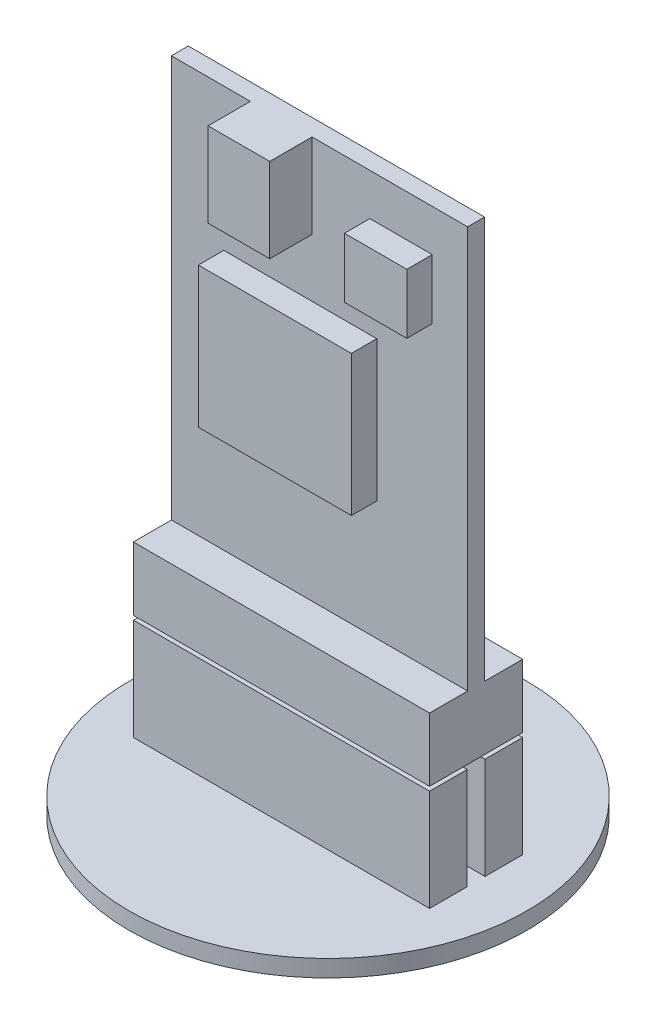
ISO-10303-21;
HEADER;
FILE_DESCRIPTION(('STEP AP214'),'2;1');
FILE_NAME('part.step','',(''),(''),'','','');
FILE_SCHEMA(('AUTOMOTIVE_DESIGN { 1 0 10303 214 1 1 1 1 }'));
ENDSEC;
DATA;
#1=APPLICATION_CONTEXT('core data for automotive mechanical design processes');
#2=APPLICATION_PROTOCOL_DEFINITION('international standard','automotive_design',2000,#1);
#3=PRODUCT_CONTEXT('',#1,'mechanical');
#4=PRODUCT('Part','Part','',(#3));
#5=PRODUCT_RELATED_PRODUCT_CATEGORY('part','',(#4));
#6=PRODUCT_DEFINITION_FORMATION('','',#4);
#7=PRODUCT_DEFINITION_CONTEXT('part definition',#1,'design');
#8=PRODUCT_DEFINITION('design','',#6,#7);
#9=PRODUCT_DEFINITION_SHAPE('','',#8);
#10=(LENGTH_UNIT() NAMED_UNIT(*) SI_UNIT(.MILLI.,.METRE.));
#11=(NAMED_UNIT(*) PLANE_ANGLE_UNIT() SI_UNIT($,.RADIAN.));
#12=(NAMED_UNIT(*) SI_UNIT($,.STERADIAN.) SOLID_ANGLE_UNIT());
#13=UNCERTAINTY_MEASURE_WITH_UNIT(LENGTH_MEASURE(1.E-05),#10,'distance_accuracy_value','');
#14=(GEOMETRIC_REPRESENTATION_CONTEXT(3) GLOBAL_UNCERTAINTY_ASSIGNED_CONTEXT((#13)) GLOBAL_UNIT_ASSIGNED_CONTEXT((#10,
#11,#12)) REPRESENTATION_CONTEXT('',''));
#15=CARTESIAN_POINT('',(0.,0.,0.));
#16=DIRECTION('',(0.,0.,1.));
#17=DIRECTION('',(1.,0.,0.));
#18=AXIS2_PLACEMENT_3D('',#15,#16,#17);
#19=CARTESIAN_POINT('',(0.,-16.,0.4));
#20=DIRECTION('',(0.,-1.,0.));
#21=DIRECTION('',(0.,0.,-1.));
#22=AXIS2_PLACEMENT_3D('',#19,#20,#21);
#23=PLANE('',#22);
#24=DIRECTION('',(-1.,0.,0.));
#25=VECTOR('',#24,1.);
#26=CARTESIAN_POINT('',(-6.99999999999999,-16.,2.6));
#27=LINE('',#26,#25);
#28=CARTESIAN_POINT('',(7.00000000000001,-16.,2.6));
#29=VERTEX_POINT('',#28);
#30=CARTESIAN_POINT('',(-6.99999999999999,-16.,2.6));
#31=VERTEX_POINT('',#30);
#32=EDGE_CURVE('E157',#29,#31,#27,.T.);
#33=ORIENTED_EDGE('',*,*,#32,.T.);
#34=DIRECTION('',(0.,0.,-1.));
#35=VECTOR('',#34,1.);
#36=CARTESIAN_POINT('',(-6.99999999999999,-16.,2.6));
#37=LINE('',#36,#35);
#38=CARTESIAN_POINT('',(-6.99999999999999,-16.,0.82));
#39=VERTEX_POINT('',#38);
#40=EDGE_CURVE('E147',#31,#39,#37,.T.);
#41=ORIENTED_EDGE('',*,*,#40,.T.);
#42=DIRECTION('',(1.,0.,0.));
#43=VECTOR('',#42,1.);
#44=CARTESIAN_POINT('',(-6.99999999999999,-16.,0.82));
#45=LINE('',#44,#43);
#46=CARTESIAN_POINT('',(7.00000000000001,-16.,0.82));
#47=VERTEX_POINT('',#46);
#48=EDGE_CURVE('E150',#39,#47,#45,.T.);
#49=ORIENTED_EDGE('',*,*,#48,.T.);
#50=DIRECTION('',(0.,0.,1.));
#51=VECTOR('',#50,1.);
#52=CARTESIAN_POINT('',(7.00000000000001,-16.,2.6));
#53=LINE('',#52,#51);
#54=EDGE_CURVE('E154',#47,#29,#53,.T.);
#55=ORIENTED_EDGE('',*,*,#54,.T.);
#56=EDGE_LOOP('',(#33,#41,#49,#55));
#57=FACE_BOUND('',#56,.T.);
#58=CARTESIAN_POINT('',(0.,-16.,0.4));
#59=DIRECTION('',(0.,-1.,0.));
#60=DIRECTION('',(0.,0.,-1.));
#61=AXIS2_PLACEMENT_3D('',#58,#59,#60);
#62=CIRCLE('',#61,9.4);
#63=CARTESIAN_POINT('',(0.,-16.,-9.));
#64=VERTEX_POINT('',#63);
#65=EDGE_CURVE('E140',#64,#64,#62,.T.);
#66=ORIENTED_EDGE('',*,*,#65,.F.);
#67=EDGE_LOOP('',(#66));
#68=FACE_BOUND('',#67,.T.);
#69=DIRECTION('',(0.,0.,1.));
#70=VECTOR('',#69,1.);
#71=CARTESIAN_POINT('',(7.00000000000001,-16.,-1.8));
#72=LINE('',#71,#70);
#73=CARTESIAN_POINT('',(7.00000000000001,-16.,-1.8));
#74=VERTEX_POINT('',#73);
#75=CARTESIAN_POINT('',(7.00000000000001,-16.,-0.0199999999999998));
#76=VERTEX_POINT('',#75);
#77=EDGE_CURVE('E58',#74,#76,#72,.T.);
#78=ORIENTED_EDGE('',*,*,#77,.T.);
#79=DIRECTION('',(-1.,0.,0.));
#80=VECTOR('',#79,1.);
#81=CARTESIAN_POINT('',(7.00000000000001,-16.,-0.0199999999999998));
#82=LINE('',#81,#80);
#83=CARTESIAN_POINT('',(-6.99999999999999,-16.,-0.0200000000000017));
#84=VERTEX_POINT('',#83);
#85=EDGE_CURVE('E62',#76,#84,#82,.T.);
#86=ORIENTED_EDGE('',*,*,#85,.T.);
#87=DIRECTION('',(0.,0.,-1.));
#88=VECTOR('',#87,1.);
#89=CARTESIAN_POINT('',(-6.99999999999999,-16.,-1.8));
#90=LINE('',#89,#88);
#91=CARTESIAN_POINT('',(-6.99999999999999,-16.,-1.8));
#92=VERTEX_POINT('',#91);
#93=EDGE_CURVE('E104',#84,#92,#90,.T.);
#94=ORIENTED_EDGE('',*,*,#93,.T.);
#95=DIRECTION('',(1.,0.,0.));
#96=VECTOR('',#95,1.);
#97=CARTESIAN_POINT('',(7.00000000000001,-16.,-1.8));
#98=LINE('',#97,#96);
#99=EDGE_CURVE('E107',#92,#74,#98,.T.);
#100=ORIENTED_EDGE('',*,*,#99,.T.);
#101=EDGE_LOOP('',(#78,#86,#94,#100));
#102=FACE_BOUND('',#101,.T.);
#103=ADVANCED_FACE('F43',(#57,#68,#102),#23,.F.);
#104=CARTESIAN_POINT('',(-6.99999999999999,-16.,2.6));
#105=DIRECTION('',(1.,0.,0.));
#106=DIRECTION('',(0.,0.,-1.));
#107=AXIS2_PLACEMENT_3D('',#104,#105,#106);
#108=PLANE('',#107);
#109=DIRECTION('',(0.,0.,-1.));
#110=VECTOR('',#109,1.);
#111=CARTESIAN_POINT('',(-6.99999999999999,-11.2,2.6));
#112=LINE('',#111,#110);
#113=CARTESIAN_POINT('',(-6.99999999999999,-11.2,2.6));
#114=VERTEX_POINT('',#113);
#115=CARTESIAN_POINT('',(-6.99999999999999,-11.2,0.82));
#116=VERTEX_POINT('',#115);
#117=EDGE_CURVE('E144',#114,#116,#112,.T.);
#118=ORIENTED_EDGE('',*,*,#117,.T.);
#119=DIRECTION('',(0.,1.,0.));
#120=VECTOR('',#119,1.);
#121=CARTESIAN_POINT('',(-6.99999999999999,-16.,0.82));
#122=LINE('',#121,#120);
#123=EDGE_CURVE('E12',#39,#116,#122,.T.);
#124=ORIENTED_EDGE('',*,*,#123,.F.);
#125=ORIENTED_EDGE('',*,*,#40,.F.);
#126=DIRECTION('',(0.,1.,0.));
#127=VECTOR('',#126,1.);
#128=CARTESIAN_POINT('',(-6.99999999999999,-16.,2.6));
#129=LINE('',#128,#127);
#130=EDGE_CURVE('E160',#31,#114,#129,.T.);
#131=ORIENTED_EDGE('',*,*,#130,.T.);
#132=EDGE_LOOP('',(#118,#124,#125,#131));
#133=FACE_BOUND('',#132,.T.);
#134=ADVANCED_FACE('F45',(#133),#108,.F.);
#135=CARTESIAN_POINT('',(-6.99999999999999,-16.,0.82));
#136=DIRECTION('',(0.,0.,1.));
#137=DIRECTION('',(1.,0.,0.));
#138=AXIS2_PLACEMENT_3D('',#135,#136,#137);
#139=PLANE('',#138);
#140=DIRECTION('',(1.,0.,0.));
#141=VECTOR('',#140,1.);
#142=CARTESIAN_POINT('',(-6.99999999999999,-11.2,0.82));
#143=LINE('',#142,#141);
#144=CARTESIAN_POINT('',(7.00000000000001,-11.2,0.82));
#145=VERTEX_POINT('',#144);
#146=EDGE_CURVE('E163',#116,#145,#143,.T.);
#147=ORIENTED_EDGE('',*,*,#146,.T.);
#148=DIRECTION('',(0.,1.,0.));
#149=VECTOR('',#148,1.);
#150=CARTESIAN_POINT('',(7.00000000000001,-16.,0.82));
#151=LINE('',#150,#149);
#152=EDGE_CURVE('E51',#47,#145,#151,.T.);
#153=ORIENTED_EDGE('',*,*,#152,.F.);
#154=ORIENTED_EDGE('',*,*,#48,.F.);
#155=ORIENTED_EDGE('',*,*,#123,.T.);
#156=EDGE_LOOP('',(#147,#153,#154,#155));
#157=FACE_BOUND('',#156,.T.);
#158=ADVANCED_FACE('F190',(#157),#139,.F.);
#159=CARTESIAN_POINT('',(7.00000000000001,-16.,2.6));
#160=DIRECTION('',(-1.,0.,0.));
#161=DIRECTION('',(0.,0.,1.));
#162=AXIS2_PLACEMENT_3D('',#159,#160,#161);
#163=PLANE('',#162);
#164=DIRECTION('',(0.,0.,1.));
#165=VECTOR('',#164,1.);
#166=CARTESIAN_POINT('',(7.00000000000001,-11.2,2.6));
#167=LINE('',#166,#165);
#168=CARTESIAN_POINT('',(7.00000000000001,-11.2,2.6));
#169=VERTEX_POINT('',#168);
#170=EDGE_CURVE('E165',#145,#169,#167,.T.);
#171=ORIENTED_EDGE('',*,*,#170,.T.);
#172=DIRECTION('',(0.,1.,0.));
#173=VECTOR('',#172,1.);
#174=CARTESIAN_POINT('',(7.00000000000001,-16.,2.6));
#175=LINE('',#174,#173);
#176=EDGE_CURVE('E170',#29,#169,#175,.T.);
#177=ORIENTED_EDGE('',*,*,#176,.F.);
#178=ORIENTED_EDGE('',*,*,#54,.F.);
#179=ORIENTED_EDGE('',*,*,#152,.T.);
#180=EDGE_LOOP('',(#171,#177,#178,#179));
#181=FACE_BOUND('',#180,.T.);
#182=ADVANCED_FACE('F176',(#181),#163,.F.);
#183=CARTESIAN_POINT('',(-6.99999999999999,-16.,2.6));
#184=DIRECTION('',(0.,0.,-1.));
#185=DIRECTION('',(-1.,0.,0.));
#186=AXIS2_PLACEMENT_3D('',#183,#184,#185);
#187=PLANE('',#186);
#188=DIRECTION('',(-1.,0.,0.));
#189=VECTOR('',#188,1.);
#190=CARTESIAN_POINT('',(-6.99999999999999,-11.2,2.6));
#191=LINE('',#190,#189);
#192=EDGE_CURVE('E151',#169,#114,#191,.T.);
#193=ORIENTED_EDGE('',*,*,#192,.T.);
#194=ORIENTED_EDGE('',*,*,#130,.F.);
#195=ORIENTED_EDGE('',*,*,#32,.F.);
#196=ORIENTED_EDGE('',*,*,#176,.T.);
#197=EDGE_LOOP('',(#193,#194,#195,#196));
#198=FACE_BOUND('',#197,.T.);
#199=ADVANCED_FACE('F184',(#198),#187,.F.);
#200=CARTESIAN_POINT('',(0.,-11.2,0.));
#201=DIRECTION('',(0.,-1.,0.));
#202=DIRECTION('',(0.,0.,-1.));
#203=AXIS2_PLACEMENT_3D('',#200,#201,#202);
#204=PLANE('',#203);
#205=ORIENTED_EDGE('',*,*,#117,.F.);
#206=ORIENTED_EDGE('',*,*,#192,.F.);
#207=ORIENTED_EDGE('',*,*,#170,.F.);
#208=ORIENTED_EDGE('',*,*,#146,.F.);
#209=EDGE_LOOP('',(#205,#206,#207,#208));
#210=FACE_BOUND('',#209,.T.);
#211=ADVANCED_FACE('F181',(#210),#204,.F.);
#212=CARTESIAN_POINT('',(0.,-16.8,0.4));
#213=DIRECTION('',(0.,1.,0.));
#214=DIRECTION('',(0.,0.,1.));
#215=AXIS2_PLACEMENT_3D('',#212,#213,#214);
#216=CYLINDRICAL_SURFACE('',#215,9.4);
#217=CARTESIAN_POINT('',(0.,-16.8,0.4));
#218=DIRECTION('',(0.,-1.,0.));
#219=DIRECTION('',(0.,0.,-1.));
#220=AXIS2_PLACEMENT_3D('',#217,#218,#219);
#221=CIRCLE('',#220,9.4);
#222=CARTESIAN_POINT('',(0.,-16.8,-9.));
#223=VERTEX_POINT('',#222);
#224=EDGE_CURVE('E141',#223,#223,#221,.T.);
#225=ORIENTED_EDGE('',*,*,#224,.F.);
#226=EDGE_LOOP('',(#225));
#227=FACE_BOUND('',#226,.T.);
#228=ORIENTED_EDGE('',*,*,#65,.T.);
#229=EDGE_LOOP('',(#228));
#230=FACE_BOUND('',#229,.T.);
#231=ADVANCED_FACE('F205',(#227,#230),#216,.T.);
#232=CARTESIAN_POINT('',(0.,-16.8,0.4));
#233=DIRECTION('',(0.,-1.,0.));
#234=DIRECTION('',(0.,0.,-1.));
#235=AXIS2_PLACEMENT_3D('',#232,#233,#234);
#236=PLANE('',#235);
#237=ORIENTED_EDGE('',*,*,#224,.T.);
#238=EDGE_LOOP('',(#237));
#239=FACE_BOUND('',#238,.T.);
#240=ADVANCED_FACE('F203',(#239),#236,.T.);
#241=CARTESIAN_POINT('',(7.00000000000001,-16.,-1.8));
#242=DIRECTION('',(-1.,0.,0.));
#243=DIRECTION('',(0.,0.,1.));
#244=AXIS2_PLACEMENT_3D('',#241,#242,#243);
#245=PLANE('',#244);
#246=DIRECTION('',(0.,0.,1.));
#247=VECTOR('',#246,1.);
#248=CARTESIAN_POINT('',(7.00000000000001,-11.2,-1.8));
#249=LINE('',#248,#247);
#250=CARTESIAN_POINT('',(7.00000000000001,-11.2,-1.8));
#251=VERTEX_POINT('',#250);
#252=CARTESIAN_POINT('',(7.00000000000001,-11.2,-0.0199999999999998));
#253=VERTEX_POINT('',#252);
#254=EDGE_CURVE('E128',#251,#253,#249,.T.);
#255=ORIENTED_EDGE('',*,*,#254,.T.);
#256=DIRECTION('',(0.,1.,0.));
#257=VECTOR('',#256,1.);
#258=CARTESIAN_POINT('',(7.00000000000001,-16.,-0.0199999999999998));
#259=LINE('',#258,#257);
#260=EDGE_CURVE('E137',#76,#253,#259,.T.);
#261=ORIENTED_EDGE('',*,*,#260,.F.);
#262=ORIENTED_EDGE('',*,*,#77,.F.);
#263=DIRECTION('',(0.,1.,0.));
#264=VECTOR('',#263,1.);
#265=CARTESIAN_POINT('',(7.00000000000001,-16.,-1.8));
#266=LINE('',#265,#264);
#267=EDGE_CURVE('E120',#74,#251,#266,.T.);
#268=ORIENTED_EDGE('',*,*,#267,.T.);
#269=EDGE_LOOP('',(#255,#261,#262,#268));
#270=FACE_BOUND('',#269,.T.);
#271=ADVANCED_FACE('F230',(#270),#245,.F.);
#272=CARTESIAN_POINT('',(7.00000000000001,-16.,-0.0199999999999998));
#273=DIRECTION('',(0.,0.,-1.));
#274=DIRECTION('',(-1.,0.,0.));
#275=AXIS2_PLACEMENT_3D('',#272,#273,#274);
#276=PLANE('',#275);
#277=DIRECTION('',(-1.,0.,0.));
#278=VECTOR('',#277,1.);
#279=CARTESIAN_POINT('',(7.00000000000001,-11.2,-0.0199999999999998));
#280=LINE('',#279,#278);
#281=CARTESIAN_POINT('',(-6.99999999999999,-11.2,-0.0200000000000018));
#282=VERTEX_POINT('',#281);
#283=EDGE_CURVE('E131',#253,#282,#280,.T.);
#284=ORIENTED_EDGE('',*,*,#283,.T.);
#285=DIRECTION('',(0.,1.,0.));
#286=VECTOR('',#285,1.);
#287=CARTESIAN_POINT('',(-6.99999999999999,-16.,-0.0200000000000018));
#288=LINE('',#287,#286);
#289=EDGE_CURVE('E119',#84,#282,#288,.T.);
#290=ORIENTED_EDGE('',*,*,#289,.F.);
#291=ORIENTED_EDGE('',*,*,#85,.F.);
#292=ORIENTED_EDGE('',*,*,#260,.T.);
#293=EDGE_LOOP('',(#284,#290,#291,#292));
#294=FACE_BOUND('',#293,.T.);
#295=ADVANCED_FACE('F237',(#294),#276,.F.);
#296=CARTESIAN_POINT('',(-6.99999999999999,-16.,-1.8));
#297=DIRECTION('',(1.,0.,0.));
#298=DIRECTION('',(0.,0.,-1.));
#299=AXIS2_PLACEMENT_3D('',#296,#297,#298);
#300=PLANE('',#299);
#301=DIRECTION('',(0.,0.,-1.));
#302=VECTOR('',#301,1.);
#303=CARTESIAN_POINT('',(-6.99999999999999,-11.2,-1.8));
#304=LINE('',#303,#302);
#305=CARTESIAN_POINT('',(-6.99999999999999,-11.2,-1.8));
#306=VERTEX_POINT('',#305);
#307=EDGE_CURVE('E116',#282,#306,#304,.T.);
#308=ORIENTED_EDGE('',*,*,#307,.T.);
#309=DIRECTION('',(0.,1.,0.));
#310=VECTOR('',#309,1.);
#311=CARTESIAN_POINT('',(-6.99999999999999,-16.,-1.8));
#312=LINE('',#311,#310);
#313=EDGE_CURVE('E113',#92,#306,#312,.T.);
#314=ORIENTED_EDGE('',*,*,#313,.F.);
#315=ORIENTED_EDGE('',*,*,#93,.F.);
#316=ORIENTED_EDGE('',*,*,#289,.T.);
#317=EDGE_LOOP('',(#308,#314,#315,#316));
#318=FACE_BOUND('',#317,.T.);
#319=ADVANCED_FACE('F114',(#318),#300,.F.);
#320=CARTESIAN_POINT('',(7.00000000000001,-16.,-1.8));
#321=DIRECTION('',(0.,0.,1.));
#322=DIRECTION('',(1.,0.,0.));
#323=AXIS2_PLACEMENT_3D('',#320,#321,#322);
#324=PLANE('',#323);
#325=DIRECTION('',(1.,0.,0.));
#326=VECTOR('',#325,1.);
#327=CARTESIAN_POINT('',(7.00000000000001,-11.2,-1.8));
#328=LINE('',#327,#326);
#329=EDGE_CURVE('E134',#306,#251,#328,.T.);
#330=ORIENTED_EDGE('',*,*,#329,.T.);
#331=ORIENTED_EDGE('',*,*,#267,.F.);
#332=ORIENTED_EDGE('',*,*,#99,.F.);
#333=ORIENTED_EDGE('',*,*,#313,.T.);
#334=EDGE_LOOP('',(#330,#331,#332,#333));
#335=FACE_BOUND('',#334,.T.);
#336=ADVANCED_FACE('F122',(#335),#324,.F.);
#337=CARTESIAN_POINT('',(0.,-11.2,0.));
#338=DIRECTION('',(0.,-1.,0.));
#339=DIRECTION('',(0.,0.,-1.));
#340=AXIS2_PLACEMENT_3D('',#337,#338,#339);
#341=PLANE('',#340);
#342=ORIENTED_EDGE('',*,*,#254,.F.);
#343=ORIENTED_EDGE('',*,*,#329,.F.);
#344=ORIENTED_EDGE('',*,*,#307,.F.);
#345=ORIENTED_EDGE('',*,*,#283,.F.);
#346=EDGE_LOOP('',(#342,#343,#344,#345));
#347=FACE_BOUND('',#346,.T.);
#348=ADVANCED_FACE('F257',(#347),#341,.F.);
#349=CLOSED_SHELL('',(#103,#134,#158,#182,#199,#211,#231,#240,#271,#295,#319,#336,#348));
#350=MANIFOLD_SOLID_BREP('B2',#349);
#351=CARTESIAN_POINT('',(0.,0.,0.8));
#352=DIRECTION('',(0.,0.,1.));
#353=DIRECTION('',(1.,0.,0.));
#354=AXIS2_PLACEMENT_3D('',#351,#352,#353);
#355=PLANE('',#354);
#356=DIRECTION('',(1.,0.,0.));
#357=VECTOR('',#356,1.);
#358=CARTESIAN_POINT('',(-3.2669907843399,7.01502589487291,0.8));
#359=LINE('',#358,#357);
#360=CARTESIAN_POINT('',(-3.2669907843399,7.01502589487291,0.8));
#361=VERTEX_POINT('',#360);
#362=CARTESIAN_POINT('',(-0.353594516752764,7.01502589487291,0.8));
#363=VERTEX_POINT('',#362);
#364=EDGE_CURVE('E520',#361,#363,#359,.T.);
#365=ORIENTED_EDGE('',*,*,#364,.F.);
#366=DIRECTION('',(0.,-1.,0.));
#367=VECTOR('',#366,1.);
#368=CARTESIAN_POINT('',(-3.2669907843399,11.,0.8));
#369=LINE('',#368,#367);
#370=CARTESIAN_POINT('',(-3.2669907843399,11.,0.8));
#371=VERTEX_POINT('',#370);
#372=EDGE_CURVE('E506',#371,#361,#369,.T.);
#373=ORIENTED_EDGE('',*,*,#372,.F.);
#374=DIRECTION('',(-1.,0.,0.));
#375=VECTOR('',#374,1.);
#376=CARTESIAN_POINT('',(-7.,11.,0.8));
#377=LINE('',#376,#375);
#378=CARTESIAN_POINT('',(-7.,11.,0.8));
#379=VERTEX_POINT('',#378);
#380=EDGE_CURVE('E573',#371,#379,#377,.T.);
#381=ORIENTED_EDGE('',*,*,#380,.T.);
#382=DIRECTION('',(0.,-1.,0.));
#383=VECTOR('',#382,1.);
#384=CARTESIAN_POINT('',(-7.,11.,0.8));
#385=LINE('',#384,#383);
#386=CARTESIAN_POINT('',(-6.99999999999999,-8.,0.8));
#387=VERTEX_POINT('',#386);
#388=EDGE_CURVE('E577',#379,#387,#385,.T.);
#389=ORIENTED_EDGE('',*,*,#388,.T.);
#390=DIRECTION('',(-1.,0.,0.));
#391=VECTOR('',#390,1.);
#392=CARTESIAN_POINT('',(0.,-8.,0.8));
#393=LINE('',#392,#391);
#394=CARTESIAN_POINT('',(7.00000000000001,-8.,0.8));
#395=VERTEX_POINT('',#394);
#396=EDGE_CURVE('E563',#395,#387,#393,.T.);
#397=ORIENTED_EDGE('',*,*,#396,.F.);
#398=DIRECTION('',(0.,1.,0.));
#399=VECTOR('',#398,1.);
#400=CARTESIAN_POINT('',(7.,11.,0.8));
#401=LINE('',#400,#399);
#402=CARTESIAN_POINT('',(7.,11.,0.8));
#403=VERTEX_POINT('',#402);
#404=EDGE_CURVE('E571',#395,#403,#401,.T.);
#405=ORIENTED_EDGE('',*,*,#404,.T.);
#406=CARTESIAN_POINT('',(-0.353594516752764,11.,0.8));
#407=VERTEX_POINT('',#406);
#408=EDGE_CURVE('E575',#403,#407,#377,.T.);
#409=ORIENTED_EDGE('',*,*,#408,.T.);
#410=DIRECTION('',(0.,1.,0.));
#411=VECTOR('',#410,1.);
#412=CARTESIAN_POINT('',(-0.353594516752764,11.,0.8));
#413=LINE('',#412,#411);
#414=EDGE_CURVE('E511',#363,#407,#413,.T.);
#415=ORIENTED_EDGE('',*,*,#414,.F.);
#416=EDGE_LOOP('',(#365,#373,#381,#389,#397,#405,#409,#415));
#417=FACE_BOUND('',#416,.T.);
#418=DIRECTION('',(1.,0.,0.));
#419=VECTOR('',#418,1.);
#420=CARTESIAN_POINT('',(-4.52759389883643,-2.36623120052311,0.8));
#421=LINE('',#420,#419);
#422=CARTESIAN_POINT('',(-4.52759389883643,-2.36623120052311,0.8));
#423=VERTEX_POINT('',#422);
#424=CARTESIAN_POINT('',(2.70426422916928,-2.36623120052311,0.8));
#425=VERTEX_POINT('',#424);
#426=EDGE_CURVE('E478',#423,#425,#421,.T.);
#427=ORIENTED_EDGE('',*,*,#426,.F.);
#428=DIRECTION('',(0.,-1.,0.));
#429=VECTOR('',#428,1.);
#430=CARTESIAN_POINT('',(-4.52759389883643,4.2715082710742,0.8));
#431=LINE('',#430,#429);
#432=CARTESIAN_POINT('',(-4.52759389883643,4.2715082710742,0.8));
#433=VERTEX_POINT('',#432);
#434=EDGE_CURVE('E475',#433,#423,#431,.T.);
#435=ORIENTED_EDGE('',*,*,#434,.F.);
#436=DIRECTION('',(-1.,0.,0.));
#437=VECTOR('',#436,1.);
#438=CARTESIAN_POINT('',(-4.52759389883643,4.2715082710742,0.8));
#439=LINE('',#438,#437);
#440=CARTESIAN_POINT('',(2.70426422916928,4.2715082710742,0.8));
#441=VERTEX_POINT('',#440);
#442=EDGE_CURVE('E487',#441,#433,#439,.T.);
#443=ORIENTED_EDGE('',*,*,#442,.F.);
#444=DIRECTION('',(0.,1.,0.));
#445=VECTOR('',#444,1.);
#446=CARTESIAN_POINT('',(2.70426422916928,4.2715082710742,0.8));
#447=LINE('',#446,#445);
#448=EDGE_CURVE('E495',#425,#441,#447,.T.);
#449=ORIENTED_EDGE('',*,*,#448,.F.);
#450=EDGE_LOOP('',(#427,#435,#443,#449));
#451=FACE_BOUND('',#450,.T.);
#452=DIRECTION('',(1.,0.,0.));
#453=VECTOR('',#452,1.);
#454=CARTESIAN_POINT('',(2.37647462563361,6.19727219184626,0.8));
#455=LINE('',#454,#453);
#456=CARTESIAN_POINT('',(2.37647462563361,6.19727219184626,0.8));
#457=VERTEX_POINT('',#456);
#458=CARTESIAN_POINT('',(5.32658105745464,6.19727219184626,0.8));
#459=VERTEX_POINT('',#458);
#460=EDGE_CURVE('E825',#457,#459,#455,.T.);
#461=ORIENTED_EDGE('',*,*,#460,.F.);
#462=DIRECTION('',(0.,-1.,0.));
#463=VECTOR('',#462,1.);
#464=CARTESIAN_POINT('',(2.37647462563361,9.02445752234141,0.8));
#465=LINE('',#464,#463);
#466=CARTESIAN_POINT('',(2.37647462563361,9.02445752234141,0.8));
#467=VERTEX_POINT('',#466);
#468=EDGE_CURVE('E473',#467,#457,#465,.T.);
#469=ORIENTED_EDGE('',*,*,#468,.F.);
#470=DIRECTION('',(-1.,0.,0.));
#471=VECTOR('',#470,1.);
#472=CARTESIAN_POINT('',(2.37647462563361,9.02445752234141,0.8));
#473=LINE('',#472,#471);
#474=CARTESIAN_POINT('',(5.32658105745464,9.02445752234141,0.8));
#475=VERTEX_POINT('',#474);
#476=EDGE_CURVE('E469',#475,#467,#473,.T.);
#477=ORIENTED_EDGE('',*,*,#476,.F.);
#478=DIRECTION('',(0.,1.,0.));
#479=VECTOR('',#478,1.);
#480=CARTESIAN_POINT('',(5.32658105745464,9.02445752234141,0.8));
#481=LINE('',#480,#479);
#482=EDGE_CURVE('E822',#459,#475,#481,.T.);
#483=ORIENTED_EDGE('',*,*,#482,.F.);
#484=EDGE_LOOP('',(#461,#469,#477,#483));
#485=FACE_BOUND('',#484,.T.);
#486=ADVANCED_FACE('F312',(#417,#451,#485),#355,.T.);
#487=CARTESIAN_POINT('',(7.,11.,0.8));
#488=DIRECTION('',(-1.,0.,0.));
#489=DIRECTION('',(0.,-1.,0.));
#490=AXIS2_PLACEMENT_3D('',#487,#488,#489);
#491=PLANE('',#490);
#492=ORIENTED_EDGE('',*,*,#404,.F.);
#493=DIRECTION('',(0.,0.,1.));
#494=VECTOR('',#493,1.);
#495=CARTESIAN_POINT('',(7.00000000000001,-8.,-1.8));
#496=LINE('',#495,#494);
#497=CARTESIAN_POINT('',(7.00000000000001,-8.,2.6));
#498=VERTEX_POINT('',#497);
#499=EDGE_CURVE('E560',#395,#498,#496,.T.);
#500=ORIENTED_EDGE('',*,*,#499,.T.);
#501=DIRECTION('',(0.,1.,0.));
#502=VECTOR('',#501,1.);
#503=CARTESIAN_POINT('',(7.00000000000001,-11.,2.6));
#504=LINE('',#503,#502);
#505=CARTESIAN_POINT('',(7.00000000000001,-11.,2.6));
#506=VERTEX_POINT('',#505);
#507=EDGE_CURVE('E542',#506,#498,#504,.T.);
#508=ORIENTED_EDGE('',*,*,#507,.F.);
#509=DIRECTION('',(0.,0.,-1.));
#510=VECTOR('',#509,1.);
#511=CARTESIAN_POINT('',(7.00000000000001,-11.,0.8));
#512=LINE('',#511,#510);
#513=CARTESIAN_POINT('',(7.00000000000001,-11.,-1.8));
#514=VERTEX_POINT('',#513);
#515=EDGE_CURVE('E579',#506,#514,#512,.T.);
#516=ORIENTED_EDGE('',*,*,#515,.T.);
#517=DIRECTION('',(0.,1.,0.));
#518=VECTOR('',#517,1.);
#519=CARTESIAN_POINT('',(7.00000000000001,-11.,-1.8));
#520=LINE('',#519,#518);
#521=CARTESIAN_POINT('',(7.00000000000001,-8.,-1.8));
#522=VERTEX_POINT('',#521);
#523=EDGE_CURVE('E554',#514,#522,#520,.T.);
#524=ORIENTED_EDGE('',*,*,#523,.T.);
#525=CARTESIAN_POINT('',(7.00000000000001,-8.,0.));
#526=VERTEX_POINT('',#525);
#527=EDGE_CURVE('E565',#522,#526,#496,.T.);
#528=ORIENTED_EDGE('',*,*,#527,.T.);
#529=DIRECTION('',(0.,1.,0.));
#530=VECTOR('',#529,1.);
#531=CARTESIAN_POINT('',(7.,11.,0.));
#532=LINE('',#531,#530);
#533=CARTESIAN_POINT('',(7.,11.,0.));
#534=VERTEX_POINT('',#533);
#535=EDGE_CURVE('E570',#526,#534,#532,.T.);
#536=ORIENTED_EDGE('',*,*,#535,.T.);
#537=DIRECTION('',(0.,0.,-1.));
#538=VECTOR('',#537,1.);
#539=CARTESIAN_POINT('',(7.,11.,0.8));
#540=LINE('',#539,#538);
#541=EDGE_CURVE('E320',#403,#534,#540,.T.);
#542=ORIENTED_EDGE('',*,*,#541,.F.);
#543=EDGE_LOOP('',(#492,#500,#508,#516,#524,#528,#536,#542));
#544=FACE_BOUND('',#543,.T.);
#545=ADVANCED_FACE('F314',(#544),#491,.F.);
#546=CARTESIAN_POINT('',(-7.,11.,0.8));
#547=DIRECTION('',(0.,-1.,0.));
#548=DIRECTION('',(0.,0.,-1.));
#549=AXIS2_PLACEMENT_3D('',#546,#547,#548);
#550=PLANE('',#549);
#551=DIRECTION('',(-1.,0.,0.));
#552=VECTOR('',#551,1.);
#553=CARTESIAN_POINT('',(-7.,11.,0.));
#554=LINE('',#553,#552);
#555=CARTESIAN_POINT('',(-7.,11.,0.));
#556=VERTEX_POINT('',#555);
#557=EDGE_CURVE('E581',#534,#556,#554,.T.);
#558=ORIENTED_EDGE('',*,*,#557,.T.);
#559=DIRECTION('',(0.,0.,-1.));
#560=VECTOR('',#559,1.);
#561=CARTESIAN_POINT('',(-7.,11.,0.8));
#562=LINE('',#561,#560);
#563=EDGE_CURVE('E588',#379,#556,#562,.T.);
#564=ORIENTED_EDGE('',*,*,#563,.F.);
#565=ORIENTED_EDGE('',*,*,#380,.F.);
#566=DIRECTION('',(0.,0.,-1.));
#567=VECTOR('',#566,1.);
#568=CARTESIAN_POINT('',(-3.2669907843399,11.,2.8));
#569=LINE('',#568,#567);
#570=CARTESIAN_POINT('',(-3.2669907843399,11.,2.8));
#571=VERTEX_POINT('',#570);
#572=EDGE_CURVE('E517',#571,#371,#569,.T.);
#573=ORIENTED_EDGE('',*,*,#572,.F.);
#574=DIRECTION('',(-1.,0.,0.));
#575=VECTOR('',#574,1.);
#576=CARTESIAN_POINT('',(-3.2669907843399,11.,2.8));
#577=LINE('',#576,#575);
#578=CARTESIAN_POINT('',(-0.353594516752764,11.,2.8));
#579=VERTEX_POINT('',#578);
#580=EDGE_CURVE('E515',#579,#571,#577,.T.);
#581=ORIENTED_EDGE('',*,*,#580,.F.);
#582=DIRECTION('',(0.,0.,-1.));
#583=VECTOR('',#582,1.);
#584=CARTESIAN_POINT('',(-0.353594516752764,11.,2.8));
#585=LINE('',#584,#583);
#586=EDGE_CURVE('E527',#579,#407,#585,.T.);
#587=ORIENTED_EDGE('',*,*,#586,.T.);
#588=ORIENTED_EDGE('',*,*,#408,.F.);
#589=ORIENTED_EDGE('',*,*,#541,.T.);
#590=EDGE_LOOP('',(#558,#564,#565,#573,#581,#587,#588,#589));
#591=FACE_BOUND('',#590,.T.);
#592=ADVANCED_FACE('F594',(#591),#550,.F.);
#593=CARTESIAN_POINT('',(-7.,11.,0.8));
#594=DIRECTION('',(1.,0.,0.));
#595=DIRECTION('',(0.,1.,0.));
#596=AXIS2_PLACEMENT_3D('',#593,#594,#595);
#597=PLANE('',#596);
#598=DIRECTION('',(0.,-1.,0.));
#599=VECTOR('',#598,1.);
#600=CARTESIAN_POINT('',(-7.,11.,0.));
#601=LINE('',#600,#599);
#602=CARTESIAN_POINT('',(-6.99999999999999,-8.,0.));
#603=VERTEX_POINT('',#602);
#604=EDGE_CURVE('E574',#556,#603,#601,.T.);
#605=ORIENTED_EDGE('',*,*,#604,.T.);
#606=DIRECTION('',(0.,0.,1.));
#607=VECTOR('',#606,1.);
#608=CARTESIAN_POINT('',(-6.99999999999999,-8.,-1.8));
#609=LINE('',#608,#607);
#610=CARTESIAN_POINT('',(-6.99999999999999,-8.,-1.8));
#611=VERTEX_POINT('',#610);
#612=EDGE_CURVE('E561',#611,#603,#609,.T.);
#613=ORIENTED_EDGE('',*,*,#612,.F.);
#614=DIRECTION('',(0.,-1.,0.));
#615=VECTOR('',#614,1.);
#616=CARTESIAN_POINT('',(-6.99999999999999,-11.,-1.8));
#617=LINE('',#616,#615);
#618=CARTESIAN_POINT('',(-6.99999999999999,-11.,-1.8));
#619=VERTEX_POINT('',#618);
#620=EDGE_CURVE('E548',#611,#619,#617,.T.);
#621=ORIENTED_EDGE('',*,*,#620,.T.);
#622=DIRECTION('',(0.,0.,-1.));
#623=VECTOR('',#622,1.);
#624=CARTESIAN_POINT('',(-6.99999999999999,-11.,0.8));
#625=LINE('',#624,#623);
#626=CARTESIAN_POINT('',(-6.99999999999999,-11.,2.6));
#627=VERTEX_POINT('',#626);
#628=EDGE_CURVE('E586',#627,#619,#625,.T.);
#629=ORIENTED_EDGE('',*,*,#628,.F.);
#630=DIRECTION('',(0.,-1.,0.));
#631=VECTOR('',#630,1.);
#632=CARTESIAN_POINT('',(-6.99999999999999,-11.,2.6));
#633=LINE('',#632,#631);
#634=CARTESIAN_POINT('',(-6.99999999999999,-8.,2.6));
#635=VERTEX_POINT('',#634);
#636=EDGE_CURVE('E536',#635,#627,#633,.T.);
#637=ORIENTED_EDGE('',*,*,#636,.F.);
#638=EDGE_CURVE('E564',#387,#635,#609,.T.);
#639=ORIENTED_EDGE('',*,*,#638,.F.);
#640=ORIENTED_EDGE('',*,*,#388,.F.);
#641=ORIENTED_EDGE('',*,*,#563,.T.);
#642=EDGE_LOOP('',(#605,#613,#621,#629,#637,#639,#640,#641));
#643=FACE_BOUND('',#642,.T.);
#644=ADVANCED_FACE('F605',(#643),#597,.F.);
#645=CARTESIAN_POINT('',(-6.99999999999999,-11.,0.8));
#646=DIRECTION('',(0.,1.,0.));
#647=DIRECTION('',(0.,0.,1.));
#648=AXIS2_PLACEMENT_3D('',#645,#646,#647);
#649=PLANE('',#648);
#650=ORIENTED_EDGE('',*,*,#628,.T.);
#651=DIRECTION('',(1.,0.,0.));
#652=VECTOR('',#651,1.);
#653=CARTESIAN_POINT('',(-6.99999999999999,-11.,-1.8));
#654=LINE('',#653,#652);
#655=EDGE_CURVE('E551',#619,#514,#654,.T.);
#656=ORIENTED_EDGE('',*,*,#655,.T.);
#657=ORIENTED_EDGE('',*,*,#515,.F.);
#658=DIRECTION('',(1.,0.,0.));
#659=VECTOR('',#658,1.);
#660=CARTESIAN_POINT('',(-6.99999999999999,-11.,2.6));
#661=LINE('',#660,#659);
#662=EDGE_CURVE('E539',#627,#506,#661,.T.);
#663=ORIENTED_EDGE('',*,*,#662,.F.);
#664=EDGE_LOOP('',(#650,#656,#657,#663));
#665=FACE_BOUND('',#664,.T.);
#666=ADVANCED_FACE('F648',(#665),#649,.F.);
#667=CARTESIAN_POINT('',(0.,0.,0.));
#668=DIRECTION('',(0.,0.,1.));
#669=DIRECTION('',(1.,0.,0.));
#670=AXIS2_PLACEMENT_3D('',#667,#668,#669);
#671=PLANE('',#670);
#672=ORIENTED_EDGE('',*,*,#535,.F.);
#673=DIRECTION('',(-1.,0.,0.));
#674=VECTOR('',#673,1.);
#675=CARTESIAN_POINT('',(0.,-8.,0.));
#676=LINE('',#675,#674);
#677=EDGE_CURVE('E41',#526,#603,#676,.T.);
#678=ORIENTED_EDGE('',*,*,#677,.T.);
#679=ORIENTED_EDGE('',*,*,#604,.F.);
#680=ORIENTED_EDGE('',*,*,#557,.F.);
#681=EDGE_LOOP('',(#672,#678,#679,#680));
#682=FACE_BOUND('',#681,.T.);
#683=ADVANCED_FACE('F603',(#682),#671,.F.);
#684=CARTESIAN_POINT('',(0.,0.,-1.8));
#685=DIRECTION('',(0.,0.,-1.));
#686=DIRECTION('',(-1.,0.,0.));
#687=AXIS2_PLACEMENT_3D('',#684,#685,#686);
#688=PLANE('',#687);
#689=ORIENTED_EDGE('',*,*,#620,.F.);
#690=DIRECTION('',(-1.,0.,0.));
#691=VECTOR('',#690,1.);
#692=CARTESIAN_POINT('',(-6.99999999999999,-8.,-1.8));
#693=LINE('',#692,#691);
#694=EDGE_CURVE('E557',#522,#611,#693,.T.);
#695=ORIENTED_EDGE('',*,*,#694,.F.);
#696=ORIENTED_EDGE('',*,*,#523,.F.);
#697=ORIENTED_EDGE('',*,*,#655,.F.);
#698=EDGE_LOOP('',(#689,#695,#696,#697));
#699=FACE_BOUND('',#698,.T.);
#700=ADVANCED_FACE('F647',(#699),#688,.T.);
#701=CARTESIAN_POINT('',(-6.99999999999999,-8.,-1.8));
#702=DIRECTION('',(0.,1.,0.));
#703=DIRECTION('',(0.,0.,1.));
#704=AXIS2_PLACEMENT_3D('',#701,#702,#703);
#705=PLANE('',#704);
#706=ORIENTED_EDGE('',*,*,#677,.F.);
#707=ORIENTED_EDGE('',*,*,#527,.F.);
#708=ORIENTED_EDGE('',*,*,#694,.T.);
#709=ORIENTED_EDGE('',*,*,#612,.T.);
#710=EDGE_LOOP('',(#706,#707,#708,#709));
#711=FACE_BOUND('',#710,.T.);
#712=ADVANCED_FACE('F678',(#711),#705,.T.);
#713=ORIENTED_EDGE('',*,*,#499,.F.);
#714=ORIENTED_EDGE('',*,*,#396,.T.);
#715=ORIENTED_EDGE('',*,*,#638,.T.);
#716=DIRECTION('',(-1.,0.,0.));
#717=VECTOR('',#716,1.);
#718=CARTESIAN_POINT('',(-6.99999999999999,-8.,2.6));
#719=LINE('',#718,#717);
#720=EDGE_CURVE('E545',#498,#635,#719,.T.);
#721=ORIENTED_EDGE('',*,*,#720,.F.);
#722=EDGE_LOOP('',(#713,#714,#715,#721));
#723=FACE_BOUND('',#722,.T.);
#724=ADVANCED_FACE('F643',(#723),#705,.T.);
#725=CARTESIAN_POINT('',(0.,0.,2.6));
#726=DIRECTION('',(0.,0.,-1.));
#727=DIRECTION('',(-1.,0.,0.));
#728=AXIS2_PLACEMENT_3D('',#725,#726,#727);
#729=PLANE('',#728);
#730=ORIENTED_EDGE('',*,*,#636,.T.);
#731=ORIENTED_EDGE('',*,*,#662,.T.);
#732=ORIENTED_EDGE('',*,*,#507,.T.);
#733=ORIENTED_EDGE('',*,*,#720,.T.);
#734=EDGE_LOOP('',(#730,#731,#732,#733));
#735=FACE_BOUND('',#734,.T.);
#736=ADVANCED_FACE('F634',(#735),#729,.F.);
#737=CARTESIAN_POINT('',(-3.2669907843399,11.,2.8));
#738=DIRECTION('',(1.,0.,0.));
#739=DIRECTION('',(0.,0.,-1.));
#740=AXIS2_PLACEMENT_3D('',#737,#738,#739);
#741=PLANE('',#740);
#742=ORIENTED_EDGE('',*,*,#372,.T.);
#743=DIRECTION('',(0.,0.,-1.));
#744=VECTOR('',#743,1.);
#745=CARTESIAN_POINT('',(-3.2669907843399,7.01502589487291,2.8));
#746=LINE('',#745,#744);
#747=CARTESIAN_POINT('',(-3.2669907843399,7.01502589487291,2.8));
#748=VERTEX_POINT('',#747);
#749=EDGE_CURVE('E533',#748,#361,#746,.T.);
#750=ORIENTED_EDGE('',*,*,#749,.F.);
#751=DIRECTION('',(0.,-1.,0.));
#752=VECTOR('',#751,1.);
#753=CARTESIAN_POINT('',(-3.2669907843399,11.,2.8));
#754=LINE('',#753,#752);
#755=EDGE_CURVE('E507',#571,#748,#754,.T.);
#756=ORIENTED_EDGE('',*,*,#755,.F.);
#757=ORIENTED_EDGE('',*,*,#572,.T.);
#758=EDGE_LOOP('',(#742,#750,#756,#757));
#759=FACE_BOUND('',#758,.T.);
#760=ADVANCED_FACE('F617',(#759),#741,.F.);
#761=CARTESIAN_POINT('',(-3.2669907843399,7.01502589487291,2.8));
#762=DIRECTION('',(0.,1.,0.));
#763=DIRECTION('',(0.,0.,1.));
#764=AXIS2_PLACEMENT_3D('',#761,#762,#763);
#765=PLANE('',#764);
#766=ORIENTED_EDGE('',*,*,#364,.T.);
#767=DIRECTION('',(0.,0.,-1.));
#768=VECTOR('',#767,1.);
#769=CARTESIAN_POINT('',(-0.353594516752764,7.01502589487291,2.8));
#770=LINE('',#769,#768);
#771=CARTESIAN_POINT('',(-0.353594516752764,7.01502589487291,2.8));
#772=VERTEX_POINT('',#771);
#773=EDGE_CURVE('E530',#772,#363,#770,.T.);
#774=ORIENTED_EDGE('',*,*,#773,.F.);
#775=DIRECTION('',(1.,0.,0.));
#776=VECTOR('',#775,1.);
#777=CARTESIAN_POINT('',(-3.2669907843399,7.01502589487291,2.8));
#778=LINE('',#777,#776);
#779=EDGE_CURVE('E510',#748,#772,#778,.T.);
#780=ORIENTED_EDGE('',*,*,#779,.F.);
#781=ORIENTED_EDGE('',*,*,#749,.T.);
#782=EDGE_LOOP('',(#766,#774,#780,#781));
#783=FACE_BOUND('',#782,.T.);
#784=ADVANCED_FACE('F626',(#783),#765,.F.);
#785=CARTESIAN_POINT('',(-0.353594516752764,11.,2.8));
#786=DIRECTION('',(-1.,0.,0.));
#787=DIRECTION('',(0.,0.,1.));
#788=AXIS2_PLACEMENT_3D('',#785,#786,#787);
#789=PLANE('',#788);
#790=ORIENTED_EDGE('',*,*,#414,.T.);
#791=ORIENTED_EDGE('',*,*,#586,.F.);
#792=DIRECTION('',(0.,1.,0.));
#793=VECTOR('',#792,1.);
#794=CARTESIAN_POINT('',(-0.353594516752764,11.,2.8));
#795=LINE('',#794,#793);
#796=EDGE_CURVE('E513',#772,#579,#795,.T.);
#797=ORIENTED_EDGE('',*,*,#796,.F.);
#798=ORIENTED_EDGE('',*,*,#773,.T.);
#799=EDGE_LOOP('',(#790,#791,#797,#798));
#800=FACE_BOUND('',#799,.T.);
#801=ADVANCED_FACE('F624',(#800),#789,.F.);
#802=CARTESIAN_POINT('',(0.,0.,2.8));
#803=DIRECTION('',(0.,0.,1.));
#804=DIRECTION('',(1.,0.,0.));
#805=AXIS2_PLACEMENT_3D('',#802,#803,#804);
#806=PLANE('',#805);
#807=ORIENTED_EDGE('',*,*,#755,.T.);
#808=ORIENTED_EDGE('',*,*,#779,.T.);
#809=ORIENTED_EDGE('',*,*,#796,.T.);
#810=ORIENTED_EDGE('',*,*,#580,.T.);
#811=EDGE_LOOP('',(#807,#808,#809,#810));
#812=FACE_BOUND('',#811,.T.);
#813=ADVANCED_FACE('F619',(#812),#806,.T.);
#814=CARTESIAN_POINT('',(-4.52759389883643,4.2715082710742,2.));
#815=DIRECTION('',(1.,0.,0.));
#816=DIRECTION('',(0.,0.,-1.));
#817=AXIS2_PLACEMENT_3D('',#814,#815,#816);
#818=PLANE('',#817);
#819=ORIENTED_EDGE('',*,*,#434,.T.);
#820=DIRECTION('',(0.,0.,-1.));
#821=VECTOR('',#820,1.);
#822=CARTESIAN_POINT('',(-4.52759389883643,-2.36623120052311,2.));
#823=LINE('',#822,#821);
#824=CARTESIAN_POINT('',(-4.52759389883643,-2.36623120052311,2.));
#825=VERTEX_POINT('',#824);
#826=EDGE_CURVE('E504',#825,#423,#823,.T.);
#827=ORIENTED_EDGE('',*,*,#826,.F.);
#828=DIRECTION('',(0.,-1.,0.));
#829=VECTOR('',#828,1.);
#830=CARTESIAN_POINT('',(-4.52759389883643,4.2715082710742,2.));
#831=LINE('',#830,#829);
#832=CARTESIAN_POINT('',(-4.52759389883643,4.2715082710742,2.));
#833=VERTEX_POINT('',#832);
#834=EDGE_CURVE('E483',#833,#825,#831,.T.);
#835=ORIENTED_EDGE('',*,*,#834,.F.);
#836=DIRECTION('',(0.,0.,-1.));
#837=VECTOR('',#836,1.);
#838=CARTESIAN_POINT('',(-4.52759389883643,4.2715082710742,2.));
#839=LINE('',#838,#837);
#840=EDGE_CURVE('E492',#833,#433,#839,.T.);
#841=ORIENTED_EDGE('',*,*,#840,.T.);
#842=EDGE_LOOP('',(#819,#827,#835,#841));
#843=FACE_BOUND('',#842,.T.);
#844=ADVANCED_FACE('F718',(#843),#818,.F.);
#845=CARTESIAN_POINT('',(-4.52759389883643,-2.36623120052311,2.));
#846=DIRECTION('',(0.,1.,0.));
#847=DIRECTION('',(0.,0.,1.));
#848=AXIS2_PLACEMENT_3D('',#845,#846,#847);
#849=PLANE('',#848);
#850=ORIENTED_EDGE('',*,*,#426,.T.);
#851=DIRECTION('',(0.,0.,-1.));
#852=VECTOR('',#851,1.);
#853=CARTESIAN_POINT('',(2.70426422916928,-2.36623120052311,2.));
#854=LINE('',#853,#852);
#855=CARTESIAN_POINT('',(2.70426422916928,-2.36623120052311,2.));
#856=VERTEX_POINT('',#855);
#857=EDGE_CURVE('E501',#856,#425,#854,.T.);
#858=ORIENTED_EDGE('',*,*,#857,.F.);
#859=DIRECTION('',(1.,0.,0.));
#860=VECTOR('',#859,1.);
#861=CARTESIAN_POINT('',(-4.52759389883643,-2.36623120052311,2.));
#862=LINE('',#861,#860);
#863=EDGE_CURVE('E486',#825,#856,#862,.T.);
#864=ORIENTED_EDGE('',*,*,#863,.F.);
#865=ORIENTED_EDGE('',*,*,#826,.T.);
#866=EDGE_LOOP('',(#850,#858,#864,#865));
#867=FACE_BOUND('',#866,.T.);
#868=ADVANCED_FACE('F732',(#867),#849,.F.);
#869=CARTESIAN_POINT('',(2.70426422916928,4.2715082710742,2.));
#870=DIRECTION('',(-1.,0.,0.));
#871=DIRECTION('',(0.,0.,1.));
#872=AXIS2_PLACEMENT_3D('',#869,#870,#871);
#873=PLANE('',#872);
#874=ORIENTED_EDGE('',*,*,#448,.T.);
#875=DIRECTION('',(0.,0.,-1.));
#876=VECTOR('',#875,1.);
#877=CARTESIAN_POINT('',(2.70426422916928,4.2715082710742,2.));
#878=LINE('',#877,#876);
#879=CARTESIAN_POINT('',(2.70426422916928,4.2715082710742,2.));
#880=VERTEX_POINT('',#879);
#881=EDGE_CURVE('E335',#880,#441,#878,.T.);
#882=ORIENTED_EDGE('',*,*,#881,.F.);
#883=DIRECTION('',(0.,1.,0.));
#884=VECTOR('',#883,1.);
#885=CARTESIAN_POINT('',(2.70426422916928,4.2715082710742,2.));
#886=LINE('',#885,#884);
#887=EDGE_CURVE('E489',#856,#880,#886,.T.);
#888=ORIENTED_EDGE('',*,*,#887,.F.);
#889=ORIENTED_EDGE('',*,*,#857,.T.);
#890=EDGE_LOOP('',(#874,#882,#888,#889));
#891=FACE_BOUND('',#890,.T.);
#892=ADVANCED_FACE('F742',(#891),#873,.F.);
#893=CARTESIAN_POINT('',(-4.52759389883643,4.2715082710742,2.));
#894=DIRECTION('',(0.,-1.,0.));
#895=DIRECTION('',(0.,0.,-1.));
#896=AXIS2_PLACEMENT_3D('',#893,#894,#895);
#897=PLANE('',#896);
#898=ORIENTED_EDGE('',*,*,#442,.T.);
#899=ORIENTED_EDGE('',*,*,#840,.F.);
#900=DIRECTION('',(-1.,0.,0.));
#901=VECTOR('',#900,1.);
#902=CARTESIAN_POINT('',(-4.52759389883643,4.2715082710742,2.));
#903=LINE('',#902,#901);
#904=EDGE_CURVE('E491',#880,#833,#903,.T.);
#905=ORIENTED_EDGE('',*,*,#904,.F.);
#906=ORIENTED_EDGE('',*,*,#881,.T.);
#907=EDGE_LOOP('',(#898,#899,#905,#906));
#908=FACE_BOUND('',#907,.T.);
#909=ADVANCED_FACE('F752',(#908),#897,.F.);
#910=CARTESIAN_POINT('',(0.,0.,2.));
#911=DIRECTION('',(0.,0.,1.));
#912=DIRECTION('',(1.,0.,0.));
#913=AXIS2_PLACEMENT_3D('',#910,#911,#912);
#914=PLANE('',#913);
#915=ORIENTED_EDGE('',*,*,#834,.T.);
#916=ORIENTED_EDGE('',*,*,#863,.T.);
#917=ORIENTED_EDGE('',*,*,#887,.T.);
#918=ORIENTED_EDGE('',*,*,#904,.T.);
#919=EDGE_LOOP('',(#915,#916,#917,#918));
#920=FACE_BOUND('',#919,.T.);
#921=ADVANCED_FACE('F762',(#920),#914,.T.);
#922=CARTESIAN_POINT('',(2.37647462563361,9.02445752234141,2.));
#923=DIRECTION('',(1.,0.,0.));
#924=DIRECTION('',(0.,0.,-1.));
#925=AXIS2_PLACEMENT_3D('',#922,#923,#924);
#926=PLANE('',#925);
#927=ORIENTED_EDGE('',*,*,#468,.T.);
#928=DIRECTION('',(0.,0.,-1.));
#929=VECTOR('',#928,1.);
#930=CARTESIAN_POINT('',(2.37647462563361,6.19727219184626,2.));
#931=LINE('',#930,#929);
#932=CARTESIAN_POINT('',(2.37647462563361,6.19727219184626,2.));
#933=VERTEX_POINT('',#932);
#934=EDGE_CURVE('E454',#933,#457,#931,.T.);
#935=ORIENTED_EDGE('',*,*,#934,.F.);
#936=DIRECTION('',(0.,-1.,0.));
#937=VECTOR('',#936,1.);
#938=CARTESIAN_POINT('',(2.37647462563361,9.02445752234141,2.));
#939=LINE('',#938,#937);
#940=CARTESIAN_POINT('',(2.37647462563361,9.02445752234141,2.));
#941=VERTEX_POINT('',#940);
#942=EDGE_CURVE('E461',#941,#933,#939,.T.);
#943=ORIENTED_EDGE('',*,*,#942,.F.);
#944=DIRECTION('',(0.,0.,-1.));
#945=VECTOR('',#944,1.);
#946=CARTESIAN_POINT('',(2.37647462563361,9.02445752234141,2.));
#947=LINE('',#946,#945);
#948=EDGE_CURVE('E819',#941,#467,#947,.T.);
#949=ORIENTED_EDGE('',*,*,#948,.T.);
#950=EDGE_LOOP('',(#927,#935,#943,#949));
#951=FACE_BOUND('',#950,.T.);
#952=ADVANCED_FACE('F471',(#951),#926,.F.);
#953=CARTESIAN_POINT('',(2.37647462563361,6.19727219184626,2.));
#954=DIRECTION('',(0.,1.,0.));
#955=DIRECTION('',(0.,0.,1.));
#956=AXIS2_PLACEMENT_3D('',#953,#954,#955);
#957=PLANE('',#956);
#958=ORIENTED_EDGE('',*,*,#460,.T.);
#959=DIRECTION('',(0.,0.,-1.));
#960=VECTOR('',#959,1.);
#961=CARTESIAN_POINT('',(5.32658105745464,6.19727219184626,2.));
#962=LINE('',#961,#960);
#963=CARTESIAN_POINT('',(5.32658105745464,6.19727219184626,2.));
#964=VERTEX_POINT('',#963);
#965=EDGE_CURVE('E457',#964,#459,#962,.T.);
#966=ORIENTED_EDGE('',*,*,#965,.F.);
#967=DIRECTION('',(1.,0.,0.));
#968=VECTOR('',#967,1.);
#969=CARTESIAN_POINT('',(2.37647462563361,6.19727219184626,2.));
#970=LINE('',#969,#968);
#971=EDGE_CURVE('E450',#933,#964,#970,.T.);
#972=ORIENTED_EDGE('',*,*,#971,.F.);
#973=ORIENTED_EDGE('',*,*,#934,.T.);
#974=EDGE_LOOP('',(#958,#966,#972,#973));
#975=FACE_BOUND('',#974,.T.);
#976=ADVANCED_FACE('F452',(#975),#957,.F.);
#977=CARTESIAN_POINT('',(5.32658105745464,9.02445752234141,2.));
#978=DIRECTION('',(-1.,0.,0.));
#979=DIRECTION('',(0.,0.,1.));
#980=AXIS2_PLACEMENT_3D('',#977,#978,#979);
#981=PLANE('',#980);
#982=ORIENTED_EDGE('',*,*,#482,.T.);
#983=DIRECTION('',(0.,0.,-1.));
#984=VECTOR('',#983,1.);
#985=CARTESIAN_POINT('',(5.32658105745464,9.02445752234141,2.));
#986=LINE('',#985,#984);
#987=CARTESIAN_POINT('',(5.32658105745464,9.02445752234141,2.));
#988=VERTEX_POINT('',#987);
#989=EDGE_CURVE('E327',#988,#475,#986,.T.);
#990=ORIENTED_EDGE('',*,*,#989,.F.);
#991=DIRECTION('',(0.,1.,0.));
#992=VECTOR('',#991,1.);
#993=CARTESIAN_POINT('',(5.32658105745464,9.02445752234141,2.));
#994=LINE('',#993,#992);
#995=EDGE_CURVE('E460',#964,#988,#994,.T.);
#996=ORIENTED_EDGE('',*,*,#995,.F.);
#997=ORIENTED_EDGE('',*,*,#965,.T.);
#998=EDGE_LOOP('',(#982,#990,#996,#997));
#999=FACE_BOUND('',#998,.T.);
#1000=ADVANCED_FACE('F788',(#999),#981,.F.);
#1001=CARTESIAN_POINT('',(2.37647462563361,9.02445752234141,2.));
#1002=DIRECTION('',(0.,-1.,0.));
#1003=DIRECTION('',(0.,0.,-1.));
#1004=AXIS2_PLACEMENT_3D('',#1001,#1002,#1003);
#1005=PLANE('',#1004);
#1006=ORIENTED_EDGE('',*,*,#476,.T.);
#1007=ORIENTED_EDGE('',*,*,#948,.F.);
#1008=DIRECTION('',(-1.,0.,0.));
#1009=VECTOR('',#1008,1.);
#1010=CARTESIAN_POINT('',(2.37647462563361,9.02445752234141,2.));
#1011=LINE('',#1010,#1009);
#1012=EDGE_CURVE('E465',#988,#941,#1011,.T.);
#1013=ORIENTED_EDGE('',*,*,#1012,.F.);
#1014=ORIENTED_EDGE('',*,*,#989,.T.);
#1015=EDGE_LOOP('',(#1006,#1007,#1013,#1014));
#1016=FACE_BOUND('',#1015,.T.);
#1017=ADVANCED_FACE('F797',(#1016),#1005,.F.);
#1018=CARTESIAN_POINT('',(0.,0.,2.));
#1019=DIRECTION('',(0.,0.,1.));
#1020=DIRECTION('',(1.,0.,0.));
#1021=AXIS2_PLACEMENT_3D('',#1018,#1019,#1020);
#1022=PLANE('',#1021);
#1023=ORIENTED_EDGE('',*,*,#942,.T.);
#1024=ORIENTED_EDGE('',*,*,#971,.T.);
#1025=ORIENTED_EDGE('',*,*,#995,.T.);
#1026=ORIENTED_EDGE('',*,*,#1012,.T.);
#1027=EDGE_LOOP('',(#1023,#1024,#1025,#1026));
#1028=FACE_BOUND('',#1027,.T.);
#1029=ADVANCED_FACE('F464',(#1028),#1022,.T.);
#1030=CLOSED_SHELL('',(#486,#545,#592,#644,#666,#683,#700,#712,#724,#736,#760,#784,#801,#813,
#844,#868,#892,#909,#921,#952,#976,#1000,#1017,#1029));
#1031=MANIFOLD_SOLID_BREP('B6',#1030);
#1032=ADVANCED_BREP_SHAPE_REPRESENTATION('',(#18,#350,#1031),#14);
#1033=SHAPE_DEFINITION_REPRESENTATION(#9,#1032);
ENDSEC;
END-ISO-10303-21;
